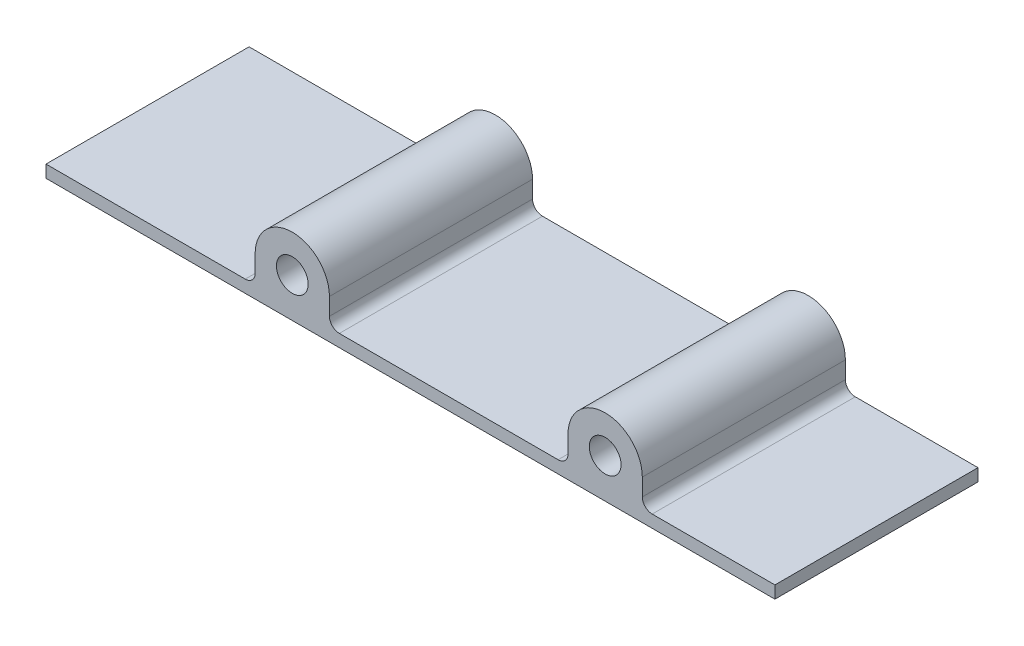
ISO-10303-21;
HEADER;
FILE_DESCRIPTION(('STEP AP214'),'2;1');
FILE_NAME('part.step','',(''),(''),'','','');
FILE_SCHEMA(('AUTOMOTIVE_DESIGN { 1 0 10303 214 1 1 1 1 }'));
ENDSEC;
DATA;
#1=APPLICATION_CONTEXT('core data for automotive mechanical design processes');
#2=APPLICATION_PROTOCOL_DEFINITION('international standard','automotive_design',2000,#1);
#3=PRODUCT_CONTEXT('',#1,'mechanical');
#4=PRODUCT('Part','Part','',(#3));
#5=PRODUCT_RELATED_PRODUCT_CATEGORY('part','',(#4));
#6=PRODUCT_DEFINITION_FORMATION('','',#4);
#7=PRODUCT_DEFINITION_CONTEXT('part definition',#1,'design');
#8=PRODUCT_DEFINITION('design','',#6,#7);
#9=PRODUCT_DEFINITION_SHAPE('','',#8);
#10=(LENGTH_UNIT() NAMED_UNIT(*) SI_UNIT(.MILLI.,.METRE.));
#11=(NAMED_UNIT(*) PLANE_ANGLE_UNIT() SI_UNIT($,.RADIAN.));
#12=(NAMED_UNIT(*) SI_UNIT($,.STERADIAN.) SOLID_ANGLE_UNIT());
#13=UNCERTAINTY_MEASURE_WITH_UNIT(LENGTH_MEASURE(1.E-05),#10,'distance_accuracy_value','');
#14=(GEOMETRIC_REPRESENTATION_CONTEXT(3) GLOBAL_UNCERTAINTY_ASSIGNED_CONTEXT((#13)) GLOBAL_UNIT_ASSIGNED_CONTEXT((#10,
#11,#12)) REPRESENTATION_CONTEXT('',''));
#15=CARTESIAN_POINT('',(0.,0.,0.));
#16=DIRECTION('',(0.,0.,1.));
#17=DIRECTION('',(1.,0.,0.));
#18=AXIS2_PLACEMENT_3D('',#15,#16,#17);
#19=CARTESIAN_POINT('',(0.,3.175,52.09999994));
#20=DIRECTION('',(0.,-1.,0.));
#21=DIRECTION('',(0.,0.,-1.));
#22=AXIS2_PLACEMENT_3D('',#19,#20,#21);
#23=PLANE('',#22);
#24=DIRECTION('',(-1.,0.,0.));
#25=VECTOR('',#24,1.);
#26=CARTESIAN_POINT('',(0.,3.175,52.09999994));
#27=LINE('',#26,#25);
#28=CARTESIAN_POINT('',(51.11504,3.175,52.09999994));
#29=VERTEX_POINT('',#28);
#30=CARTESIAN_POINT('',(0.,3.175,52.09999994));
#31=VERTEX_POINT('',#30);
#32=EDGE_CURVE('E166',#29,#31,#27,.T.);
#33=ORIENTED_EDGE('',*,*,#32,.F.);
#34=DIRECTION('',(0.,0.,-1.));
#35=VECTOR('',#34,1.);
#36=CARTESIAN_POINT('',(51.11504,3.175,52.09999994));
#37=LINE('',#36,#35);
#38=CARTESIAN_POINT('',(51.11504,3.175,0.));
#39=VERTEX_POINT('',#38);
#40=EDGE_CURVE('E187',#29,#39,#37,.T.);
#41=ORIENTED_EDGE('',*,*,#40,.T.);
#42=DIRECTION('',(-1.,0.,0.));
#43=VECTOR('',#42,1.);
#44=CARTESIAN_POINT('',(0.,3.175,0.));
#45=LINE('',#44,#43);
#46=CARTESIAN_POINT('',(0.,3.175,0.));
#47=VERTEX_POINT('',#46);
#48=EDGE_CURVE('E180',#39,#47,#45,.T.);
#49=ORIENTED_EDGE('',*,*,#48,.T.);
#50=DIRECTION('',(0.,0.,-1.));
#51=VECTOR('',#50,1.);
#52=CARTESIAN_POINT('',(0.,3.175,52.09999994));
#53=LINE('',#52,#51);
#54=EDGE_CURVE('E174',#31,#47,#53,.T.);
#55=ORIENTED_EDGE('',*,*,#54,.F.);
#56=EDGE_LOOP('',(#33,#41,#49,#55));
#57=FACE_BOUND('',#56,.T.);
#58=ADVANCED_FACE('F36',(#57),#23,.F.);
#59=CARTESIAN_POINT('',(131.37904,3.175,0.));
#60=VERTEX_POINT('',#59);
#61=CARTESIAN_POINT('',(75.25504,3.175,0.));
#62=VERTEX_POINT('',#61);
#63=EDGE_CURVE('E182',#60,#62,#45,.T.);
#64=ORIENTED_EDGE('',*,*,#63,.T.);
#65=DIRECTION('',(0.,0.,-1.));
#66=VECTOR('',#65,1.);
#67=CARTESIAN_POINT('',(75.25504,3.175,52.09999994));
#68=LINE('',#67,#66);
#69=CARTESIAN_POINT('',(75.25504,3.175,52.09999994));
#70=VERTEX_POINT('',#69);
#71=EDGE_CURVE('E198',#62,#70,#68,.F.);
#72=ORIENTED_EDGE('',*,*,#71,.T.);
#73=CARTESIAN_POINT('',(131.37904,3.175,52.09999994));
#74=VERTEX_POINT('',#73);
#75=EDGE_CURVE('E168',#74,#70,#27,.T.);
#76=ORIENTED_EDGE('',*,*,#75,.F.);
#77=DIRECTION('',(0.,0.,-1.));
#78=VECTOR('',#77,1.);
#79=CARTESIAN_POINT('',(131.37904,3.175,52.09999994));
#80=LINE('',#79,#78);
#81=EDGE_CURVE('E195',#74,#60,#80,.T.);
#82=ORIENTED_EDGE('',*,*,#81,.T.);
#83=EDGE_LOOP('',(#64,#72,#76,#82));
#84=FACE_BOUND('',#83,.T.);
#85=ADVANCED_FACE('F310',(#84),#23,.F.);
#86=CARTESIAN_POINT('',(187.00242,3.175,52.09999994));
#87=VERTEX_POINT('',#86);
#88=CARTESIAN_POINT('',(155.51904,3.175,52.09999994));
#89=VERTEX_POINT('',#88);
#90=EDGE_CURVE('E58',#87,#89,#27,.T.);
#91=ORIENTED_EDGE('',*,*,#90,.F.);
#92=DIRECTION('',(0.,0.,-1.));
#93=VECTOR('',#92,1.);
#94=CARTESIAN_POINT('',(187.00242,3.175,52.09999994));
#95=LINE('',#94,#93);
#96=CARTESIAN_POINT('',(187.00242,3.175,0.));
#97=VERTEX_POINT('',#96);
#98=EDGE_CURVE('E149',#87,#97,#95,.T.);
#99=ORIENTED_EDGE('',*,*,#98,.T.);
#100=CARTESIAN_POINT('',(155.51904,3.175,0.));
#101=VERTEX_POINT('',#100);
#102=EDGE_CURVE('E170',#97,#101,#45,.T.);
#103=ORIENTED_EDGE('',*,*,#102,.T.);
#104=DIRECTION('',(0.,0.,-1.));
#105=VECTOR('',#104,1.);
#106=CARTESIAN_POINT('',(155.51904,3.175,52.09999994));
#107=LINE('',#106,#105);
#108=EDGE_CURVE('E205',#101,#89,#107,.F.);
#109=ORIENTED_EDGE('',*,*,#108,.T.);
#110=EDGE_LOOP('',(#91,#99,#103,#109));
#111=FACE_BOUND('',#110,.T.);
#112=ADVANCED_FACE('F232',(#111),#23,.F.);
#113=CARTESIAN_POINT('',(0.,0.,52.09999994));
#114=DIRECTION('',(1.,0.,0.));
#115=DIRECTION('',(0.,0.,-1.));
#116=AXIS2_PLACEMENT_3D('',#113,#114,#115);
#117=PLANE('',#116);
#118=DIRECTION('',(0.,-1.,0.));
#119=VECTOR('',#118,1.);
#120=CARTESIAN_POINT('',(0.,0.,0.));
#121=LINE('',#120,#119);
#122=CARTESIAN_POINT('',(0.,0.,0.));
#123=VERTEX_POINT('',#122);
#124=EDGE_CURVE('E175',#47,#123,#121,.T.);
#125=ORIENTED_EDGE('',*,*,#124,.T.);
#126=DIRECTION('',(0.,0.,-1.));
#127=VECTOR('',#126,1.);
#128=CARTESIAN_POINT('',(0.,0.,52.09999994));
#129=LINE('',#128,#127);
#130=CARTESIAN_POINT('',(0.,0.,52.09999994));
#131=VERTEX_POINT('',#130);
#132=EDGE_CURVE('E185',#131,#123,#129,.T.);
#133=ORIENTED_EDGE('',*,*,#132,.F.);
#134=DIRECTION('',(0.,-1.,0.));
#135=VECTOR('',#134,1.);
#136=CARTESIAN_POINT('',(0.,0.,52.09999994));
#137=LINE('',#136,#135);
#138=EDGE_CURVE('E164',#31,#131,#137,.T.);
#139=ORIENTED_EDGE('',*,*,#138,.F.);
#140=ORIENTED_EDGE('',*,*,#54,.T.);
#141=EDGE_LOOP('',(#125,#133,#139,#140));
#142=FACE_BOUND('',#141,.T.);
#143=ADVANCED_FACE('F319',(#142),#117,.F.);
#144=CARTESIAN_POINT('',(0.,0.,52.09999994));
#145=DIRECTION('',(0.,1.,0.));
#146=DIRECTION('',(0.,0.,1.));
#147=AXIS2_PLACEMENT_3D('',#144,#145,#146);
#148=PLANE('',#147);
#149=DIRECTION('',(1.,0.,0.));
#150=VECTOR('',#149,1.);
#151=CARTESIAN_POINT('',(0.,0.,0.));
#152=LINE('',#151,#150);
#153=CARTESIAN_POINT('',(187.00242,0.,0.));
#154=VERTEX_POINT('',#153);
#155=EDGE_CURVE('E159',#123,#154,#152,.T.);
#156=ORIENTED_EDGE('',*,*,#155,.T.);
#157=DIRECTION('',(0.,0.,-1.));
#158=VECTOR('',#157,1.);
#159=CARTESIAN_POINT('',(187.00242,0.,52.09999994));
#160=LINE('',#159,#158);
#161=CARTESIAN_POINT('',(187.00242,0.,52.09999994));
#162=VERTEX_POINT('',#161);
#163=EDGE_CURVE('E51',#162,#154,#160,.T.);
#164=ORIENTED_EDGE('',*,*,#163,.F.);
#165=DIRECTION('',(1.,0.,0.));
#166=VECTOR('',#165,1.);
#167=CARTESIAN_POINT('',(0.,0.,52.09999994));
#168=LINE('',#167,#166);
#169=EDGE_CURVE('E157',#131,#162,#168,.T.);
#170=ORIENTED_EDGE('',*,*,#169,.F.);
#171=ORIENTED_EDGE('',*,*,#132,.T.);
#172=EDGE_LOOP('',(#156,#164,#170,#171));
#173=FACE_BOUND('',#172,.T.);
#174=ADVANCED_FACE('F155',(#173),#148,.F.);
#175=CARTESIAN_POINT('',(0.,0.,52.09999994));
#176=DIRECTION('',(0.,0.,-1.));
#177=DIRECTION('',(-1.,0.,0.));
#178=AXIS2_PLACEMENT_3D('',#175,#176,#177);
#179=PLANE('',#178);
#180=ORIENTED_EDGE('',*,*,#169,.T.);
#181=DIRECTION('',(0.,1.,0.));
#182=VECTOR('',#181,1.);
#183=CARTESIAN_POINT('',(187.00242,0.,52.09999994));
#184=LINE('',#183,#182);
#185=EDGE_CURVE('E146',#162,#87,#184,.T.);
#186=ORIENTED_EDGE('',*,*,#185,.T.);
#187=ORIENTED_EDGE('',*,*,#90,.T.);
#188=CARTESIAN_POINT('',(155.51904,5.715,52.09999994));
#189=DIRECTION('',(0.,0.,-1.));
#190=DIRECTION('',(-1.,0.,0.));
#191=AXIS2_PLACEMENT_3D('',#188,#189,#190);
#192=CIRCLE('',#191,2.54);
#193=CARTESIAN_POINT('',(152.97904,5.715,52.09999994));
#194=VERTEX_POINT('',#193);
#195=EDGE_CURVE('E11',#89,#194,#192,.T.);
#196=ORIENTED_EDGE('',*,*,#195,.T.);
#197=DIRECTION('',(0.,1.,0.));
#198=VECTOR('',#197,1.);
#199=CARTESIAN_POINT('',(152.97904,10.11428,52.09999994));
#200=LINE('',#199,#198);
#201=CARTESIAN_POINT('',(152.97904,10.11428,52.09999994));
#202=VERTEX_POINT('',#201);
#203=EDGE_CURVE('E266',#194,#202,#200,.T.);
#204=ORIENTED_EDGE('',*,*,#203,.T.);
#205=CARTESIAN_POINT('',(143.44904,10.11428,52.09999994));
#206=DIRECTION('',(0.,0.,-1.));
#207=DIRECTION('',(-1.,0.,0.));
#208=AXIS2_PLACEMENT_3D('',#205,#206,#207);
#209=CIRCLE('',#208,9.53000000000001);
#210=CARTESIAN_POINT('',(133.91904,10.11428,52.09999994));
#211=VERTEX_POINT('',#210);
#212=EDGE_CURVE('E267',#202,#211,#209,.F.);
#213=ORIENTED_EDGE('',*,*,#212,.T.);
#214=DIRECTION('',(0.,-1.,0.));
#215=VECTOR('',#214,1.);
#216=CARTESIAN_POINT('',(133.91904,10.11428,52.09999994));
#217=LINE('',#216,#215);
#218=CARTESIAN_POINT('',(133.91904,5.71500000000002,52.09999994));
#219=VERTEX_POINT('',#218);
#220=EDGE_CURVE('E263',#211,#219,#217,.T.);
#221=ORIENTED_EDGE('',*,*,#220,.T.);
#222=CARTESIAN_POINT('',(131.37904,5.715,52.09999994));
#223=DIRECTION('',(0.,0.,-1.));
#224=DIRECTION('',(-1.,0.,0.));
#225=AXIS2_PLACEMENT_3D('',#222,#223,#224);
#226=CIRCLE('',#225,2.54);
#227=EDGE_CURVE('E217',#219,#74,#226,.T.);
#228=ORIENTED_EDGE('',*,*,#227,.T.);
#229=ORIENTED_EDGE('',*,*,#75,.T.);
#230=CARTESIAN_POINT('',(75.25504,5.715,52.09999994));
#231=DIRECTION('',(0.,0.,-1.));
#232=DIRECTION('',(-1.,0.,0.));
#233=AXIS2_PLACEMENT_3D('',#230,#231,#232);
#234=CIRCLE('',#233,2.54);
#235=CARTESIAN_POINT('',(72.71504,5.715,52.09999994));
#236=VERTEX_POINT('',#235);
#237=EDGE_CURVE('E213',#70,#236,#234,.T.);
#238=ORIENTED_EDGE('',*,*,#237,.T.);
#239=DIRECTION('',(0.,1.,0.));
#240=VECTOR('',#239,1.);
#241=CARTESIAN_POINT('',(72.71504,10.11428,52.09999994));
#242=LINE('',#241,#240);
#243=CARTESIAN_POINT('',(72.71504,10.11428,52.09999994));
#244=VERTEX_POINT('',#243);
#245=EDGE_CURVE('E244',#236,#244,#242,.T.);
#246=ORIENTED_EDGE('',*,*,#245,.T.);
#247=CARTESIAN_POINT('',(63.18504,10.11428,52.09999994));
#248=DIRECTION('',(0.,0.,-1.));
#249=DIRECTION('',(-1.,0.,0.));
#250=AXIS2_PLACEMENT_3D('',#247,#248,#249);
#251=CIRCLE('',#250,9.53000000000001);
#252=CARTESIAN_POINT('',(53.65504,10.11428,52.09999994));
#253=VERTEX_POINT('',#252);
#254=EDGE_CURVE('E245',#244,#253,#251,.F.);
#255=ORIENTED_EDGE('',*,*,#254,.T.);
#256=DIRECTION('',(0.,-1.,0.));
#257=VECTOR('',#256,1.);
#258=CARTESIAN_POINT('',(53.6550399999999,10.11428,52.09999994));
#259=LINE('',#258,#257);
#260=CARTESIAN_POINT('',(53.65504,5.71500000000002,52.09999994));
#261=VERTEX_POINT('',#260);
#262=EDGE_CURVE('E240',#253,#261,#259,.T.);
#263=ORIENTED_EDGE('',*,*,#262,.T.);
#264=CARTESIAN_POINT('',(51.11504,5.715,52.09999994));
#265=DIRECTION('',(0.,0.,-1.));
#266=DIRECTION('',(-1.,0.,0.));
#267=AXIS2_PLACEMENT_3D('',#264,#265,#266);
#268=CIRCLE('',#267,2.54);
#269=EDGE_CURVE('E209',#261,#29,#268,.T.);
#270=ORIENTED_EDGE('',*,*,#269,.T.);
#271=ORIENTED_EDGE('',*,*,#32,.T.);
#272=ORIENTED_EDGE('',*,*,#138,.T.);
#273=EDGE_LOOP('',(#180,#186,#187,#196,#204,#213,#221,#228,#229,#238,#246,#255,#263,#270,#271,#272));
#274=FACE_BOUND('',#273,.T.);
#275=CARTESIAN_POINT('',(143.44904,10.11428,52.09999994));
#276=DIRECTION('',(0.,0.,-1.));
#277=DIRECTION('',(-1.,0.,0.));
#278=AXIS2_PLACEMENT_3D('',#275,#276,#277);
#279=CIRCLE('',#278,4.075);
#280=CARTESIAN_POINT('',(139.37404,10.11428,52.09999994));
#281=VERTEX_POINT('',#280);
#282=EDGE_CURVE('E178',#281,#281,#279,.F.);
#283=ORIENTED_EDGE('',*,*,#282,.F.);
#284=EDGE_LOOP('',(#283));
#285=FACE_BOUND('',#284,.T.);
#286=CARTESIAN_POINT('',(63.18504,10.11428,52.09999994));
#287=DIRECTION('',(0.,0.,-1.));
#288=DIRECTION('',(-1.,0.,0.));
#289=AXIS2_PLACEMENT_3D('',#286,#287,#288);
#290=CIRCLE('',#289,4.075);
#291=CARTESIAN_POINT('',(59.11004,10.11428,52.09999994));
#292=VERTEX_POINT('',#291);
#293=EDGE_CURVE('E243',#292,#292,#290,.F.);
#294=ORIENTED_EDGE('',*,*,#293,.F.);
#295=EDGE_LOOP('',(#294));
#296=FACE_BOUND('',#295,.T.);
#297=ADVANCED_FACE('F161',(#274,#285,#296),#179,.F.);
#298=CARTESIAN_POINT('',(0.,0.,0.));
#299=DIRECTION('',(0.,0.,-1.));
#300=DIRECTION('',(-1.,0.,0.));
#301=AXIS2_PLACEMENT_3D('',#298,#299,#300);
#302=PLANE('',#301);
#303=DIRECTION('',(0.,1.,0.));
#304=VECTOR('',#303,1.);
#305=CARTESIAN_POINT('',(187.00242,0.,0.));
#306=LINE('',#305,#304);
#307=EDGE_CURVE('E151',#154,#97,#306,.T.);
#308=ORIENTED_EDGE('',*,*,#307,.F.);
#309=ORIENTED_EDGE('',*,*,#155,.F.);
#310=ORIENTED_EDGE('',*,*,#124,.F.);
#311=ORIENTED_EDGE('',*,*,#48,.F.);
#312=CARTESIAN_POINT('',(51.11504,5.715,0.));
#313=DIRECTION('',(0.,0.,-1.));
#314=DIRECTION('',(-1.,0.,0.));
#315=AXIS2_PLACEMENT_3D('',#312,#313,#314);
#316=CIRCLE('',#315,2.54);
#317=CARTESIAN_POINT('',(53.65504,5.71500000000002,0.));
#318=VERTEX_POINT('',#317);
#319=EDGE_CURVE('E207',#39,#318,#316,.F.);
#320=ORIENTED_EDGE('',*,*,#319,.T.);
#321=DIRECTION('',(0.,1.,0.));
#322=VECTOR('',#321,1.);
#323=CARTESIAN_POINT('',(53.6550399999999,10.11428,0.));
#324=LINE('',#323,#322);
#325=CARTESIAN_POINT('',(53.65504,10.11428,0.));
#326=VERTEX_POINT('',#325);
#327=EDGE_CURVE('E236',#318,#326,#324,.T.);
#328=ORIENTED_EDGE('',*,*,#327,.T.);
#329=CARTESIAN_POINT('',(63.18504,10.11428,0.));
#330=DIRECTION('',(0.,0.,-1.));
#331=DIRECTION('',(-1.,0.,0.));
#332=AXIS2_PLACEMENT_3D('',#329,#330,#331);
#333=CIRCLE('',#332,9.53000000000001);
#334=CARTESIAN_POINT('',(72.71504,10.11428,0.));
#335=VERTEX_POINT('',#334);
#336=EDGE_CURVE('E250',#326,#335,#333,.T.);
#337=ORIENTED_EDGE('',*,*,#336,.T.);
#338=DIRECTION('',(0.,-1.,0.));
#339=VECTOR('',#338,1.);
#340=CARTESIAN_POINT('',(72.71504,10.11428,0.));
#341=LINE('',#340,#339);
#342=CARTESIAN_POINT('',(72.71504,5.715,0.));
#343=VERTEX_POINT('',#342);
#344=EDGE_CURVE('E253',#335,#343,#341,.T.);
#345=ORIENTED_EDGE('',*,*,#344,.T.);
#346=CARTESIAN_POINT('',(75.25504,5.715,0.));
#347=DIRECTION('',(0.,0.,-1.));
#348=DIRECTION('',(-1.,0.,0.));
#349=AXIS2_PLACEMENT_3D('',#346,#347,#348);
#350=CIRCLE('',#349,2.54);
#351=EDGE_CURVE('E211',#343,#62,#350,.F.);
#352=ORIENTED_EDGE('',*,*,#351,.T.);
#353=ORIENTED_EDGE('',*,*,#63,.F.);
#354=CARTESIAN_POINT('',(131.37904,5.715,0.));
#355=DIRECTION('',(0.,0.,-1.));
#356=DIRECTION('',(-1.,0.,0.));
#357=AXIS2_PLACEMENT_3D('',#354,#355,#356);
#358=CIRCLE('',#357,2.54);
#359=CARTESIAN_POINT('',(133.91904,5.71500000000002,0.));
#360=VERTEX_POINT('',#359);
#361=EDGE_CURVE('E215',#60,#360,#358,.F.);
#362=ORIENTED_EDGE('',*,*,#361,.T.);
#363=DIRECTION('',(0.,1.,0.));
#364=VECTOR('',#363,1.);
#365=CARTESIAN_POINT('',(133.91904,10.11428,0.));
#366=LINE('',#365,#364);
#367=CARTESIAN_POINT('',(133.91904,10.11428,0.));
#368=VERTEX_POINT('',#367);
#369=EDGE_CURVE('E273',#360,#368,#366,.T.);
#370=ORIENTED_EDGE('',*,*,#369,.T.);
#371=CARTESIAN_POINT('',(143.44904,10.11428,0.));
#372=DIRECTION('',(0.,0.,-1.));
#373=DIRECTION('',(-1.,0.,0.));
#374=AXIS2_PLACEMENT_3D('',#371,#372,#373);
#375=CIRCLE('',#374,9.53000000000001);
#376=CARTESIAN_POINT('',(152.97904,10.11428,0.));
#377=VERTEX_POINT('',#376);
#378=EDGE_CURVE('E275',#368,#377,#375,.T.);
#379=ORIENTED_EDGE('',*,*,#378,.T.);
#380=DIRECTION('',(0.,-1.,0.));
#381=VECTOR('',#380,1.);
#382=CARTESIAN_POINT('',(152.97904,10.11428,0.));
#383=LINE('',#382,#381);
#384=CARTESIAN_POINT('',(152.97904,5.715,0.));
#385=VERTEX_POINT('',#384);
#386=EDGE_CURVE('E227',#377,#385,#383,.T.);
#387=ORIENTED_EDGE('',*,*,#386,.T.);
#388=CARTESIAN_POINT('',(155.51904,5.715,0.));
#389=DIRECTION('',(0.,0.,-1.));
#390=DIRECTION('',(-1.,0.,0.));
#391=AXIS2_PLACEMENT_3D('',#388,#389,#390);
#392=CIRCLE('',#391,2.54);
#393=EDGE_CURVE('E44',#385,#101,#392,.F.);
#394=ORIENTED_EDGE('',*,*,#393,.T.);
#395=ORIENTED_EDGE('',*,*,#102,.F.);
#396=EDGE_LOOP('',(#308,#309,#310,#311,#320,#328,#337,#345,#352,#353,#362,#370,#379,#387,#394,#395));
#397=FACE_BOUND('',#396,.T.);
#398=CARTESIAN_POINT('',(143.44904,10.11428,0.));
#399=DIRECTION('',(0.,0.,-1.));
#400=DIRECTION('',(-1.,0.,0.));
#401=AXIS2_PLACEMENT_3D('',#398,#399,#400);
#402=CIRCLE('',#401,4.075);
#403=CARTESIAN_POINT('',(139.37404,10.11428,0.));
#404=VERTEX_POINT('',#403);
#405=EDGE_CURVE('E262',#404,#404,#402,.T.);
#406=ORIENTED_EDGE('',*,*,#405,.F.);
#407=EDGE_LOOP('',(#406));
#408=FACE_BOUND('',#407,.T.);
#409=CARTESIAN_POINT('',(63.18504,10.11428,0.));
#410=DIRECTION('',(0.,0.,-1.));
#411=DIRECTION('',(-1.,0.,0.));
#412=AXIS2_PLACEMENT_3D('',#409,#410,#411);
#413=CIRCLE('',#412,4.075);
#414=CARTESIAN_POINT('',(59.11004,10.11428,0.));
#415=VERTEX_POINT('',#414);
#416=EDGE_CURVE('E233',#415,#415,#413,.T.);
#417=ORIENTED_EDGE('',*,*,#416,.F.);
#418=EDGE_LOOP('',(#417));
#419=FACE_BOUND('',#418,.T.);
#420=ADVANCED_FACE('F223',(#397,#408,#419),#302,.T.);
#421=CARTESIAN_POINT('',(133.91904,10.11428,77.2896959230483));
#422=DIRECTION('',(-1.,0.,0.));
#423=DIRECTION('',(0.,-1.,0.));
#424=AXIS2_PLACEMENT_3D('',#421,#422,#423);
#425=PLANE('',#424);
#426=ORIENTED_EDGE('',*,*,#369,.F.);
#427=DIRECTION('',(0.,0.,-1.));
#428=VECTOR('',#427,1.);
#429=CARTESIAN_POINT('',(133.91904,5.71500000000002,77.2896959230483));
#430=LINE('',#429,#428);
#431=EDGE_CURVE('E200',#360,#219,#430,.F.);
#432=ORIENTED_EDGE('',*,*,#431,.T.);
#433=ORIENTED_EDGE('',*,*,#220,.F.);
#434=DIRECTION('',(0.,0.,-1.));
#435=VECTOR('',#434,1.);
#436=CARTESIAN_POINT('',(133.91904,10.11428,77.2896959230483));
#437=LINE('',#436,#435);
#438=EDGE_CURVE('E278',#211,#368,#437,.T.);
#439=ORIENTED_EDGE('',*,*,#438,.T.);
#440=EDGE_LOOP('',(#426,#432,#433,#439));
#441=FACE_BOUND('',#440,.T.);
#442=ADVANCED_FACE('F300',(#441),#425,.T.);
#443=CARTESIAN_POINT('',(143.44904,10.11428,77.2896959230483));
#444=DIRECTION('',(0.,0.,-1.));
#445=DIRECTION('',(-1.,0.,0.));
#446=AXIS2_PLACEMENT_3D('',#443,#444,#445);
#447=CYLINDRICAL_SURFACE('',#446,9.53000000000001);
#448=ORIENTED_EDGE('',*,*,#212,.F.);
#449=DIRECTION('',(0.,0.,-1.));
#450=VECTOR('',#449,1.);
#451=CARTESIAN_POINT('',(152.97904,10.11428,77.2896959230483));
#452=LINE('',#451,#450);
#453=EDGE_CURVE('E269',#202,#377,#452,.T.);
#454=ORIENTED_EDGE('',*,*,#453,.T.);
#455=ORIENTED_EDGE('',*,*,#378,.F.);
#456=ORIENTED_EDGE('',*,*,#438,.F.);
#457=EDGE_LOOP('',(#448,#454,#455,#456));
#458=FACE_BOUND('',#457,.T.);
#459=ADVANCED_FACE('F305',(#458),#447,.T.);
#460=CARTESIAN_POINT('',(152.97904,10.11428,77.2896959230483));
#461=DIRECTION('',(1.,0.,0.));
#462=DIRECTION('',(0.,0.,-1.));
#463=AXIS2_PLACEMENT_3D('',#460,#461,#462);
#464=PLANE('',#463);
#465=ORIENTED_EDGE('',*,*,#203,.F.);
#466=DIRECTION('',(0.,0.,-1.));
#467=VECTOR('',#466,1.);
#468=CARTESIAN_POINT('',(152.97904,5.715,77.2896959230483));
#469=LINE('',#468,#467);
#470=EDGE_CURVE('E202',#194,#385,#469,.T.);
#471=ORIENTED_EDGE('',*,*,#470,.T.);
#472=ORIENTED_EDGE('',*,*,#386,.F.);
#473=ORIENTED_EDGE('',*,*,#453,.F.);
#474=EDGE_LOOP('',(#465,#471,#472,#473));
#475=FACE_BOUND('',#474,.T.);
#476=ADVANCED_FACE('F378',(#475),#464,.T.);
#477=CARTESIAN_POINT('',(143.44904,10.11428,77.2896959230483));
#478=DIRECTION('',(0.,0.,-1.));
#479=DIRECTION('',(-1.,0.,0.));
#480=AXIS2_PLACEMENT_3D('',#477,#478,#479);
#481=CYLINDRICAL_SURFACE('',#480,4.075);
#482=ORIENTED_EDGE('',*,*,#282,.T.);
#483=EDGE_LOOP('',(#482));
#484=FACE_BOUND('',#483,.T.);
#485=ORIENTED_EDGE('',*,*,#405,.T.);
#486=EDGE_LOOP('',(#485));
#487=FACE_BOUND('',#486,.T.);
#488=ADVANCED_FACE('F284',(#484,#487),#481,.F.);
#489=CARTESIAN_POINT('',(53.6550399999999,10.11428,77.2896959230483));
#490=DIRECTION('',(-1.,0.,0.));
#491=DIRECTION('',(0.,-1.,0.));
#492=AXIS2_PLACEMENT_3D('',#489,#490,#491);
#493=PLANE('',#492);
#494=ORIENTED_EDGE('',*,*,#327,.F.);
#495=DIRECTION('',(0.,0.,-1.));
#496=VECTOR('',#495,1.);
#497=CARTESIAN_POINT('',(53.65504,5.71500000000002,77.2896959230483));
#498=LINE('',#497,#496);
#499=EDGE_CURVE('E190',#318,#261,#498,.F.);
#500=ORIENTED_EDGE('',*,*,#499,.T.);
#501=ORIENTED_EDGE('',*,*,#262,.F.);
#502=DIRECTION('',(0.,0.,-1.));
#503=VECTOR('',#502,1.);
#504=CARTESIAN_POINT('',(53.65504,10.11428,77.2896959230483));
#505=LINE('',#504,#503);
#506=EDGE_CURVE('E256',#253,#326,#505,.T.);
#507=ORIENTED_EDGE('',*,*,#506,.T.);
#508=EDGE_LOOP('',(#494,#500,#501,#507));
#509=FACE_BOUND('',#508,.T.);
#510=ADVANCED_FACE('F370',(#509),#493,.T.);
#511=CARTESIAN_POINT('',(63.18504,10.11428,77.2896959230483));
#512=DIRECTION('',(0.,0.,-1.));
#513=DIRECTION('',(-1.,0.,0.));
#514=AXIS2_PLACEMENT_3D('',#511,#512,#513);
#515=CYLINDRICAL_SURFACE('',#514,9.53000000000001);
#516=ORIENTED_EDGE('',*,*,#254,.F.);
#517=DIRECTION('',(0.,0.,-1.));
#518=VECTOR('',#517,1.);
#519=CARTESIAN_POINT('',(72.71504,10.11428,77.2896959230483));
#520=LINE('',#519,#518);
#521=EDGE_CURVE('E247',#244,#335,#520,.T.);
#522=ORIENTED_EDGE('',*,*,#521,.T.);
#523=ORIENTED_EDGE('',*,*,#336,.F.);
#524=ORIENTED_EDGE('',*,*,#506,.F.);
#525=EDGE_LOOP('',(#516,#522,#523,#524));
#526=FACE_BOUND('',#525,.T.);
#527=ADVANCED_FACE('F359',(#526),#515,.T.);
#528=CARTESIAN_POINT('',(72.71504,10.11428,77.2896959230483));
#529=DIRECTION('',(1.,0.,0.));
#530=DIRECTION('',(0.,0.,-1.));
#531=AXIS2_PLACEMENT_3D('',#528,#529,#530);
#532=PLANE('',#531);
#533=ORIENTED_EDGE('',*,*,#245,.F.);
#534=DIRECTION('',(0.,0.,-1.));
#535=VECTOR('',#534,1.);
#536=CARTESIAN_POINT('',(72.71504,5.715,77.2896959230483));
#537=LINE('',#536,#535);
#538=EDGE_CURVE('E192',#236,#343,#537,.T.);
#539=ORIENTED_EDGE('',*,*,#538,.T.);
#540=ORIENTED_EDGE('',*,*,#344,.F.);
#541=ORIENTED_EDGE('',*,*,#521,.F.);
#542=EDGE_LOOP('',(#533,#539,#540,#541));
#543=FACE_BOUND('',#542,.T.);
#544=ADVANCED_FACE('F295',(#543),#532,.T.);
#545=CARTESIAN_POINT('',(63.18504,10.11428,77.2896959230483));
#546=DIRECTION('',(0.,0.,-1.));
#547=DIRECTION('',(-1.,0.,0.));
#548=AXIS2_PLACEMENT_3D('',#545,#546,#547);
#549=CYLINDRICAL_SURFACE('',#548,4.075);
#550=ORIENTED_EDGE('',*,*,#293,.T.);
#551=EDGE_LOOP('',(#550));
#552=FACE_BOUND('',#551,.T.);
#553=ORIENTED_EDGE('',*,*,#416,.T.);
#554=EDGE_LOOP('',(#553));
#555=FACE_BOUND('',#554,.T.);
#556=ADVANCED_FACE('F291',(#552,#555),#549,.F.);
#557=CARTESIAN_POINT('',(51.11504,5.715,52.09999994));
#558=DIRECTION('',(0.,0.,-1.));
#559=DIRECTION('',(-1.,0.,0.));
#560=AXIS2_PLACEMENT_3D('',#557,#558,#559);
#561=CYLINDRICAL_SURFACE('',#560,2.54);
#562=ORIENTED_EDGE('',*,*,#269,.F.);
#563=ORIENTED_EDGE('',*,*,#499,.F.);
#564=ORIENTED_EDGE('',*,*,#319,.F.);
#565=ORIENTED_EDGE('',*,*,#40,.F.);
#566=EDGE_LOOP('',(#562,#563,#564,#565));
#567=FACE_BOUND('',#566,.T.);
#568=ADVANCED_FACE('F294',(#567),#561,.F.);
#569=CARTESIAN_POINT('',(75.25504,5.715,77.2896959230483));
#570=DIRECTION('',(0.,0.,-1.));
#571=DIRECTION('',(-1.,0.,0.));
#572=AXIS2_PLACEMENT_3D('',#569,#570,#571);
#573=CYLINDRICAL_SURFACE('',#572,2.54);
#574=ORIENTED_EDGE('',*,*,#237,.F.);
#575=ORIENTED_EDGE('',*,*,#71,.F.);
#576=ORIENTED_EDGE('',*,*,#351,.F.);
#577=ORIENTED_EDGE('',*,*,#538,.F.);
#578=EDGE_LOOP('',(#574,#575,#576,#577));
#579=FACE_BOUND('',#578,.T.);
#580=ADVANCED_FACE('F331',(#579),#573,.F.);
#581=CARTESIAN_POINT('',(131.37904,5.715,52.09999994));
#582=DIRECTION('',(0.,0.,-1.));
#583=DIRECTION('',(-1.,0.,0.));
#584=AXIS2_PLACEMENT_3D('',#581,#582,#583);
#585=CYLINDRICAL_SURFACE('',#584,2.54);
#586=ORIENTED_EDGE('',*,*,#227,.F.);
#587=ORIENTED_EDGE('',*,*,#431,.F.);
#588=ORIENTED_EDGE('',*,*,#361,.F.);
#589=ORIENTED_EDGE('',*,*,#81,.F.);
#590=EDGE_LOOP('',(#586,#587,#588,#589));
#591=FACE_BOUND('',#590,.T.);
#592=ADVANCED_FACE('F334',(#591),#585,.F.);
#593=CARTESIAN_POINT('',(155.51904,5.715,77.2896959230483));
#594=DIRECTION('',(0.,0.,-1.));
#595=DIRECTION('',(-1.,0.,0.));
#596=AXIS2_PLACEMENT_3D('',#593,#594,#595);
#597=CYLINDRICAL_SURFACE('',#596,2.54);
#598=ORIENTED_EDGE('',*,*,#195,.F.);
#599=ORIENTED_EDGE('',*,*,#108,.F.);
#600=ORIENTED_EDGE('',*,*,#393,.F.);
#601=ORIENTED_EDGE('',*,*,#470,.F.);
#602=EDGE_LOOP('',(#598,#599,#600,#601));
#603=FACE_BOUND('',#602,.T.);
#604=ADVANCED_FACE('F38',(#603),#597,.F.);
#605=CARTESIAN_POINT('',(187.00242,0.,52.09999994));
#606=DIRECTION('',(-1.,0.,0.));
#607=DIRECTION('',(0.,0.,1.));
#608=AXIS2_PLACEMENT_3D('',#605,#606,#607);
#609=PLANE('',#608);
#610=ORIENTED_EDGE('',*,*,#185,.F.);
#611=ORIENTED_EDGE('',*,*,#163,.T.);
#612=ORIENTED_EDGE('',*,*,#307,.T.);
#613=ORIENTED_EDGE('',*,*,#98,.F.);
#614=EDGE_LOOP('',(#610,#611,#612,#613));
#615=FACE_BOUND('',#614,.T.);
#616=ADVANCED_FACE('F147',(#615),#609,.F.);
#617=CLOSED_SHELL('',(#58,#85,#112,#143,#174,#297,#420,#442,#459,#476,#488,#510,#527,#544,#556,
#568,#580,#592,#604,#616));
#618=MANIFOLD_SOLID_BREP('B2',#617);
#619=ADVANCED_BREP_SHAPE_REPRESENTATION('',(#18,#618),#14);
#620=SHAPE_DEFINITION_REPRESENTATION(#9,#619);
ENDSEC;
END-ISO-10303-21;
